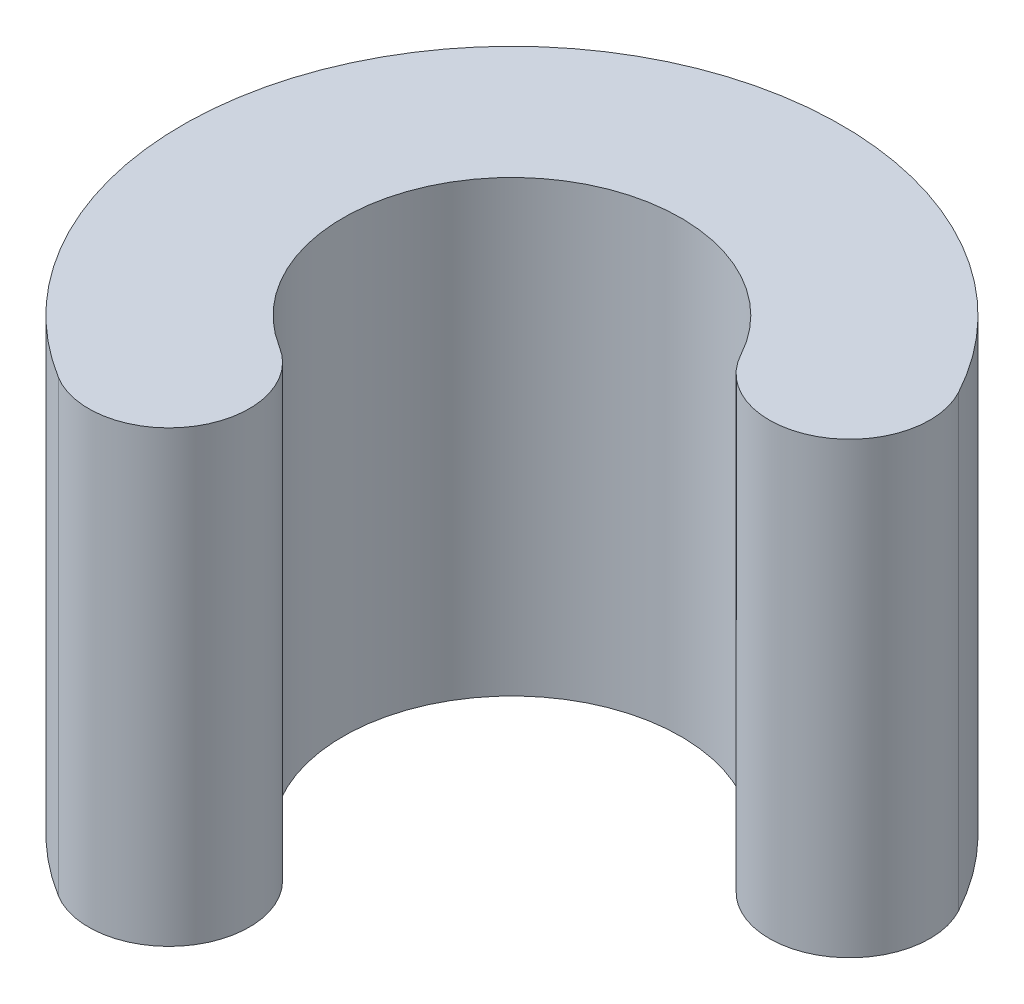
ISO-10303-21;
HEADER;
FILE_DESCRIPTION(('STEP AP214'),'2;1');
FILE_NAME('part.step','',(''),(''),'','','');
FILE_SCHEMA(('AUTOMOTIVE_DESIGN { 1 0 10303 214 1 1 1 1 }'));
ENDSEC;
DATA;
#1=APPLICATION_CONTEXT('core data for automotive mechanical design processes');
#2=APPLICATION_PROTOCOL_DEFINITION('international standard','automotive_design',2000,#1);
#3=PRODUCT_CONTEXT('',#1,'mechanical');
#4=PRODUCT('Part','Part','',(#3));
#5=PRODUCT_RELATED_PRODUCT_CATEGORY('part','',(#4));
#6=PRODUCT_DEFINITION_FORMATION('','',#4);
#7=PRODUCT_DEFINITION_CONTEXT('part definition',#1,'design');
#8=PRODUCT_DEFINITION('design','',#6,#7);
#9=PRODUCT_DEFINITION_SHAPE('','',#8);
#10=(LENGTH_UNIT() NAMED_UNIT(*) SI_UNIT(.MILLI.,.METRE.));
#11=(NAMED_UNIT(*) PLANE_ANGLE_UNIT() SI_UNIT($,.RADIAN.));
#12=(NAMED_UNIT(*) SI_UNIT($,.STERADIAN.) SOLID_ANGLE_UNIT());
#13=UNCERTAINTY_MEASURE_WITH_UNIT(LENGTH_MEASURE(1.E-05),#10,'distance_accuracy_value','');
#14=(GEOMETRIC_REPRESENTATION_CONTEXT(3) GLOBAL_UNCERTAINTY_ASSIGNED_CONTEXT((#13)) GLOBAL_UNIT_ASSIGNED_CONTEXT((#10,
#11,#12)) REPRESENTATION_CONTEXT('',''));
#15=CARTESIAN_POINT('',(0.,0.,0.));
#16=DIRECTION('',(0.,0.,1.));
#17=DIRECTION('',(1.,0.,0.));
#18=AXIS2_PLACEMENT_3D('',#15,#16,#17);
#19=CARTESIAN_POINT('',(0.,10.9,0.));
#20=DIRECTION('',(0.,-1.,0.));
#21=DIRECTION('',(0.,0.,-1.));
#22=AXIS2_PLACEMENT_3D('',#19,#20,#21);
#23=CYLINDRICAL_SURFACE('',#22,8.);
#24=CARTESIAN_POINT('',(0.,0.,0.));
#25=DIRECTION('',(0.,1.,0.));
#26=DIRECTION('',(0.,0.,1.));
#27=AXIS2_PLACEMENT_3D('',#24,#25,#26);
#28=CIRCLE('',#27,8.);
#29=CARTESIAN_POINT('',(7.04101032680033,0.,-3.79791700513467));
#30=VERTEX_POINT('',#29);
#31=CARTESIAN_POINT('',(-4.19873530875032,0.,6.80959777131171));
#32=VERTEX_POINT('',#31);
#33=EDGE_CURVE('E108',#30,#32,#28,.T.);
#34=ORIENTED_EDGE('',*,*,#33,.T.);
#35=DIRECTION('',(0.,-1.,0.));
#36=VECTOR('',#35,1.);
#37=CARTESIAN_POINT('',(-4.19873530875032,10.9,6.80959777131171));
#38=LINE('',#37,#36);
#39=CARTESIAN_POINT('',(-4.19873530875032,10.9,6.80959777131171));
#40=VERTEX_POINT('',#39);
#41=EDGE_CURVE('E11',#40,#32,#38,.T.);
#42=ORIENTED_EDGE('',*,*,#41,.F.);
#43=CARTESIAN_POINT('',(0.,10.9,0.));
#44=DIRECTION('',(0.,1.,0.));
#45=DIRECTION('',(0.,0.,1.));
#46=AXIS2_PLACEMENT_3D('',#43,#44,#45);
#47=CIRCLE('',#46,8.);
#48=CARTESIAN_POINT('',(7.04101032680033,10.9,-3.79791700513467));
#49=VERTEX_POINT('',#48);
#50=EDGE_CURVE('E89',#49,#40,#47,.T.);
#51=ORIENTED_EDGE('',*,*,#50,.F.);
#52=DIRECTION('',(0.,-1.,0.));
#53=VECTOR('',#52,1.);
#54=CARTESIAN_POINT('',(7.04101032680033,10.9,-3.79791700513467));
#55=LINE('',#54,#53);
#56=EDGE_CURVE('E104',#49,#30,#55,.T.);
#57=ORIENTED_EDGE('',*,*,#56,.T.);
#58=EDGE_LOOP('',(#34,#42,#51,#57));
#59=FACE_BOUND('',#58,.T.);
#60=ADVANCED_FACE('F41',(#59),#23,.T.);
#61=CARTESIAN_POINT('',(-3.17529357724243,10.9,5.14975831455448));
#62=DIRECTION('',(0.,-1.,0.));
#63=DIRECTION('',(0.,0.,-1.));
#64=AXIS2_PLACEMENT_3D('',#61,#62,#63);
#65=CYLINDRICAL_SURFACE('',#64,1.95);
#66=CARTESIAN_POINT('',(-3.17529357724243,0.,5.14975831455448));
#67=DIRECTION('',(0.,1.,0.));
#68=DIRECTION('',(0.,0.,1.));
#69=AXIS2_PLACEMENT_3D('',#66,#67,#68);
#70=CIRCLE('',#69,1.95);
#71=CARTESIAN_POINT('',(-2.15185184573454,0.,3.48991885779725));
#72=VERTEX_POINT('',#71);
#73=EDGE_CURVE('E95',#32,#72,#70,.T.);
#74=ORIENTED_EDGE('',*,*,#73,.T.);
#75=DIRECTION('',(0.,-1.,0.));
#76=VECTOR('',#75,1.);
#77=CARTESIAN_POINT('',(-2.15185184573454,10.9,3.48991885779725));
#78=LINE('',#77,#76);
#79=CARTESIAN_POINT('',(-2.15185184573454,10.9,3.48991885779725));
#80=VERTEX_POINT('',#79);
#81=EDGE_CURVE('E50',#80,#72,#78,.T.);
#82=ORIENTED_EDGE('',*,*,#81,.F.);
#83=CARTESIAN_POINT('',(-3.17529357724243,10.9,5.14975831455448));
#84=DIRECTION('',(0.,1.,0.));
#85=DIRECTION('',(0.,0.,1.));
#86=AXIS2_PLACEMENT_3D('',#83,#84,#85);
#87=CIRCLE('',#86,1.95);
#88=EDGE_CURVE('E84',#40,#80,#87,.T.);
#89=ORIENTED_EDGE('',*,*,#88,.F.);
#90=ORIENTED_EDGE('',*,*,#41,.T.);
#91=EDGE_LOOP('',(#74,#82,#89,#90));
#92=FACE_BOUND('',#91,.T.);
#93=ADVANCED_FACE('F94',(#92),#65,.T.);
#94=CARTESIAN_POINT('',(0.,10.9,0.));
#95=DIRECTION('',(0.,-1.,0.));
#96=DIRECTION('',(0.,0.,-1.));
#97=AXIS2_PLACEMENT_3D('',#94,#95,#96);
#98=CYLINDRICAL_SURFACE('',#97,4.1);
#99=CARTESIAN_POINT('',(0.,0.,0.));
#100=DIRECTION('',(0.,1.,0.));
#101=DIRECTION('',(0.,0.,1.));
#102=AXIS2_PLACEMENT_3D('',#99,#100,#101);
#103=CIRCLE('',#102,4.1);
#104=CARTESIAN_POINT('',(3.60851779248517,0.,-1.94643246513152));
#105=VERTEX_POINT('',#104);
#106=EDGE_CURVE('E114',#105,#72,#103,.T.);
#107=ORIENTED_EDGE('',*,*,#106,.F.);
#108=DIRECTION('',(0.,-1.,0.));
#109=VECTOR('',#108,1.);
#110=CARTESIAN_POINT('',(3.60851779248517,10.9,-1.94643246513152));
#111=LINE('',#110,#109);
#112=CARTESIAN_POINT('',(3.60851779248517,10.9,-1.94643246513152));
#113=VERTEX_POINT('',#112);
#114=EDGE_CURVE('E74',#113,#105,#111,.T.);
#115=ORIENTED_EDGE('',*,*,#114,.F.);
#116=CARTESIAN_POINT('',(0.,10.9,0.));
#117=DIRECTION('',(0.,1.,0.));
#118=DIRECTION('',(0.,0.,1.));
#119=AXIS2_PLACEMENT_3D('',#116,#117,#118);
#120=CIRCLE('',#119,4.1);
#121=EDGE_CURVE('E87',#113,#80,#120,.T.);
#122=ORIENTED_EDGE('',*,*,#121,.T.);
#123=ORIENTED_EDGE('',*,*,#81,.T.);
#124=EDGE_LOOP('',(#107,#115,#122,#123));
#125=FACE_BOUND('',#124,.T.);
#126=ADVANCED_FACE('F100',(#125),#98,.F.);
#127=CARTESIAN_POINT('',(5.32476405964275,10.9,-2.87217473513309));
#128=DIRECTION('',(0.,-1.,0.));
#129=DIRECTION('',(0.,0.,-1.));
#130=AXIS2_PLACEMENT_3D('',#127,#128,#129);
#131=CYLINDRICAL_SURFACE('',#130,1.95);
#132=CARTESIAN_POINT('',(5.32476405964275,0.,-2.87217473513309));
#133=DIRECTION('',(0.,1.,0.));
#134=DIRECTION('',(0.,0.,1.));
#135=AXIS2_PLACEMENT_3D('',#132,#133,#134);
#136=CIRCLE('',#135,1.95);
#137=EDGE_CURVE('E77',#105,#30,#136,.T.);
#138=ORIENTED_EDGE('',*,*,#137,.T.);
#139=ORIENTED_EDGE('',*,*,#56,.F.);
#140=CARTESIAN_POINT('',(5.32476405964275,10.9,-2.87217473513309));
#141=DIRECTION('',(0.,1.,0.));
#142=DIRECTION('',(0.,0.,1.));
#143=AXIS2_PLACEMENT_3D('',#140,#141,#142);
#144=CIRCLE('',#143,1.95);
#145=EDGE_CURVE('E58',#113,#49,#144,.T.);
#146=ORIENTED_EDGE('',*,*,#145,.F.);
#147=ORIENTED_EDGE('',*,*,#114,.T.);
#148=EDGE_LOOP('',(#138,#139,#146,#147));
#149=FACE_BOUND('',#148,.T.);
#150=ADVANCED_FACE('F131',(#149),#131,.T.);
#151=CARTESIAN_POINT('',(0.,10.9,0.));
#152=DIRECTION('',(0.,1.,0.));
#153=DIRECTION('',(0.,0.,1.));
#154=AXIS2_PLACEMENT_3D('',#151,#152,#153);
#155=PLANE('',#154);
#156=ORIENTED_EDGE('',*,*,#50,.T.);
#157=ORIENTED_EDGE('',*,*,#88,.T.);
#158=ORIENTED_EDGE('',*,*,#121,.F.);
#159=ORIENTED_EDGE('',*,*,#145,.T.);
#160=EDGE_LOOP('',(#156,#157,#158,#159));
#161=FACE_BOUND('',#160,.T.);
#162=ADVANCED_FACE('F85',(#161),#155,.T.);
#163=CARTESIAN_POINT('',(0.,0.,0.));
#164=DIRECTION('',(0.,1.,0.));
#165=DIRECTION('',(0.,0.,1.));
#166=AXIS2_PLACEMENT_3D('',#163,#164,#165);
#167=PLANE('',#166);
#168=ORIENTED_EDGE('',*,*,#33,.F.);
#169=ORIENTED_EDGE('',*,*,#137,.F.);
#170=ORIENTED_EDGE('',*,*,#106,.T.);
#171=ORIENTED_EDGE('',*,*,#73,.F.);
#172=EDGE_LOOP('',(#168,#169,#170,#171));
#173=FACE_BOUND('',#172,.T.);
#174=ADVANCED_FACE('F125',(#173),#167,.F.);
#175=CLOSED_SHELL('',(#60,#93,#126,#150,#162,#174));
#176=MANIFOLD_SOLID_BREP('B2',#175);
#177=ADVANCED_BREP_SHAPE_REPRESENTATION('',(#18,#176),#14);
#178=SHAPE_DEFINITION_REPRESENTATION(#9,#177);
ENDSEC;
END-ISO-10303-21;
